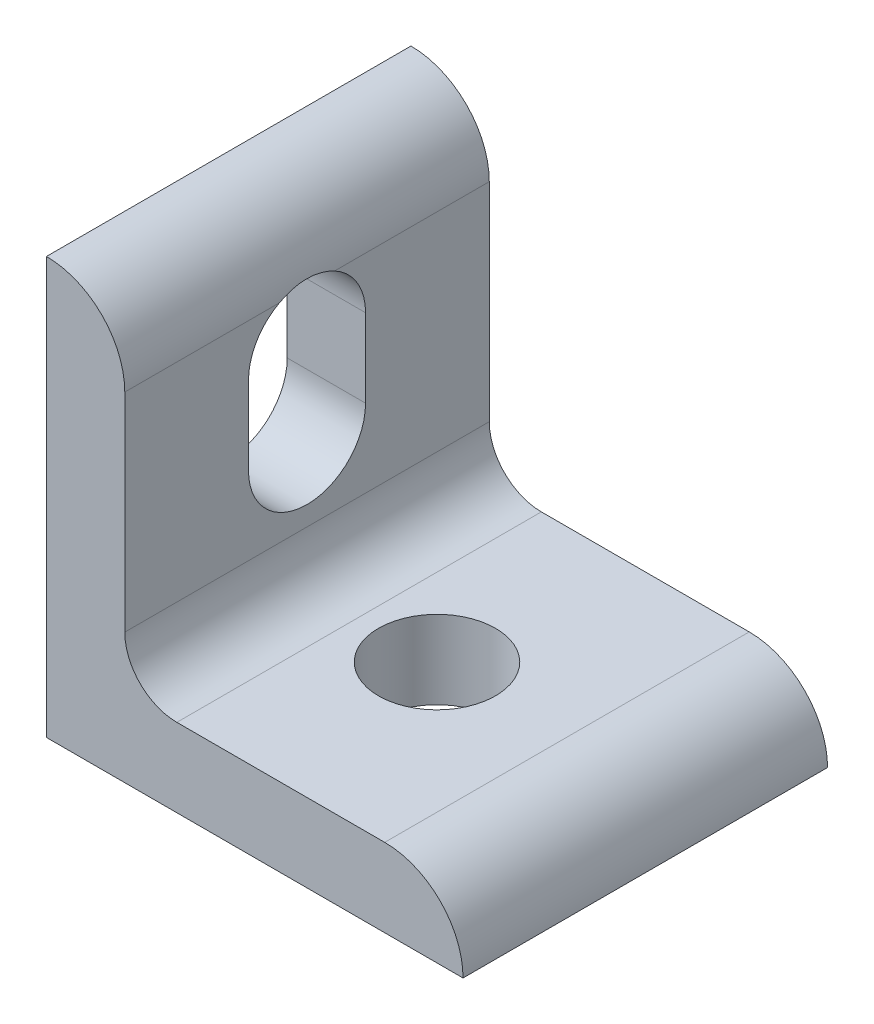
ISO-10303-21;
HEADER;
FILE_DESCRIPTION(('STEP AP214'),'2;1');
FILE_NAME('part.step','',(''),(''),'','','');
FILE_SCHEMA(('AUTOMOTIVE_DESIGN { 1 0 10303 214 1 1 1 1 }'));
ENDSEC;
DATA;
#1=APPLICATION_CONTEXT('core data for automotive mechanical design processes');
#2=APPLICATION_PROTOCOL_DEFINITION('international standard','automotive_design',2000,#1);
#3=PRODUCT_CONTEXT('',#1,'mechanical');
#4=PRODUCT('Part','Part','',(#3));
#5=PRODUCT_RELATED_PRODUCT_CATEGORY('part','',(#4));
#6=PRODUCT_DEFINITION_FORMATION('','',#4);
#7=PRODUCT_DEFINITION_CONTEXT('part definition',#1,'design');
#8=PRODUCT_DEFINITION('design','',#6,#7);
#9=PRODUCT_DEFINITION_SHAPE('','',#8);
#10=(LENGTH_UNIT() NAMED_UNIT(*) SI_UNIT(.MILLI.,.METRE.));
#11=(NAMED_UNIT(*) PLANE_ANGLE_UNIT() SI_UNIT($,.RADIAN.));
#12=(NAMED_UNIT(*) SI_UNIT($,.STERADIAN.) SOLID_ANGLE_UNIT());
#13=UNCERTAINTY_MEASURE_WITH_UNIT(LENGTH_MEASURE(1.E-05),#10,'distance_accuracy_value','');
#14=(GEOMETRIC_REPRESENTATION_CONTEXT(3) GLOBAL_UNCERTAINTY_ASSIGNED_CONTEXT((#13)) GLOBAL_UNIT_ASSIGNED_CONTEXT((#10,
#11,#12)) REPRESENTATION_CONTEXT('',''));
#15=CARTESIAN_POINT('',(0.,0.,0.));
#16=DIRECTION('',(0.,0.,1.));
#17=DIRECTION('',(1.,0.,0.));
#18=AXIS2_PLACEMENT_3D('',#15,#16,#17);
#19=CARTESIAN_POINT('',(-12.7,7.9248,-11.1125));
#20=DIRECTION('',(0.,0.,1.));
#21=DIRECTION('',(1.,0.,0.));
#22=AXIS2_PLACEMENT_3D('',#19,#20,#21);
#23=CYLINDRICAL_SURFACE('',#22,4.7752);
#24=CARTESIAN_POINT('',(-7.9248,7.9248,-1.67798674905376));
#25=CARTESIAN_POINT('',(-7.92481560049592,7.97198264026627,-1.58944695004193));
#26=CARTESIAN_POINT('',(-7.92550012205361,8.01540977478818,-1.49891433040589));
#27=CARTESIAN_POINT('',(-7.92764776843833,8.0944880787926,-1.31452958616631));
#28=CARTESIAN_POINT('',(-7.929110840339,8.13013977662215,-1.22067768761434));
#29=CARTESIAN_POINT('',(-7.93225439032208,8.19336625267331,-1.03043614312271));
#30=CARTESIAN_POINT('',(-7.93393457377953,8.22095181424074,-0.934050074774575));
#31=CARTESIAN_POINT('',(-7.93708478391002,8.26791971032118,-0.739297367598972));
#32=CARTESIAN_POINT('',(-7.93855481380049,8.28730217043143,-0.6409307591196));
#33=CARTESIAN_POINT('',(-7.94096961658513,8.31773484760735,-0.442847496805783));
#34=CARTESIAN_POINT('',(-7.94191406229188,8.32877987596424,-0.343130041511914));
#35=CARTESIAN_POINT('',(-7.94309359017064,8.3424409536407,-0.143068965573384));
#36=CARTESIAN_POINT('',(-7.94332834804512,8.34505314954708,-0.0427250796564538));
#37=CARTESIAN_POINT('',(-7.94304377497829,8.341819075309,0.157803071244914));
#38=CARTESIAN_POINT('',(-7.94252460460013,8.33597460617069,0.257987365668804));
#39=CARTESIAN_POINT('',(-7.94083039182643,8.31587724756712,0.457456784566718));
#40=CARTESIAN_POINT('',(-7.93965566575332,8.30162841323472,0.556742319252861));
#41=CARTESIAN_POINT('',(-7.93701861799582,8.26658902460885,0.744337426092724));
#42=CARTESIAN_POINT('',(-7.93559448865452,8.24655339572945,0.832789488293525));
#43=CARTESIAN_POINT('',(-7.9326683654564,8.19981049650334,1.00790623806296));
#44=CARTESIAN_POINT('',(-7.93116637764446,8.17310374348454,1.09457106366315));
#45=CARTESIAN_POINT('',(-7.92842086118506,8.11314773705982,1.26567968386014));
#46=CARTESIAN_POINT('',(-7.92717751363214,8.07989393104252,1.35012188632909));
#47=CARTESIAN_POINT('',(-7.9253721376969,8.00704969992215,1.51624796495461));
#48=CARTESIAN_POINT('',(-7.92481020248326,7.96745840914012,1.59793146243284));
#49=CARTESIAN_POINT('',(-7.9248,7.9248,1.67798674905376));
#50=B_SPLINE_CURVE_WITH_KNOTS('',3,(#24,#25,#26,#27,#28,#29,#30,#31,#32,#33,#34,#35,#36,#37,#38,
#39,#40,#41,#42,#43,#44,#45,#46,#47,#48,#49),.UNSPECIFIED.,.F.,.F.,(4,2,2,2,2,2,2,2,2,2,2,2,4),
(0.,0.300879588223929,0.60173872506888,0.902193795053617,1.20264426462115,1.50328156242041,
1.80405621808538,2.1047668275479,2.40533246174311,2.67718634841712,2.94901916008736,
3.22104166750748,3.4931013640392),.UNSPECIFIED.);
#51=CARTESIAN_POINT('',(-7.9248,7.9248,-1.67798674905376));
#52=VERTEX_POINT('',#51);
#53=CARTESIAN_POINT('',(-7.9248,7.9248,1.67798674905376));
#54=VERTEX_POINT('',#53);
#55=EDGE_CURVE('E210',#52,#54,#50,.T.);
#56=ORIENTED_EDGE('',*,*,#55,.F.);
#57=DIRECTION('',(0.,0.,1.));
#58=VECTOR('',#57,1.);
#59=CARTESIAN_POINT('',(-7.9248,7.9248,-11.1125));
#60=LINE('',#59,#58);
#61=CARTESIAN_POINT('',(-7.9248,7.9248,-11.1125));
#62=VERTEX_POINT('',#61);
#63=EDGE_CURVE('E11',#62,#52,#60,.T.);
#64=ORIENTED_EDGE('',*,*,#63,.F.);
#65=CARTESIAN_POINT('',(-12.7,7.9248,-11.1125));
#66=DIRECTION('',(0.,0.,1.));
#67=DIRECTION('',(1.,0.,0.));
#68=AXIS2_PLACEMENT_3D('',#65,#66,#67);
#69=CIRCLE('',#68,4.7752);
#70=CARTESIAN_POINT('',(-12.7,12.7,-11.1125));
#71=VERTEX_POINT('',#70);
#72=EDGE_CURVE('E335',#62,#71,#69,.T.);
#73=ORIENTED_EDGE('',*,*,#72,.T.);
#74=DIRECTION('',(0.,0.,1.));
#75=VECTOR('',#74,1.);
#76=CARTESIAN_POINT('',(-12.7,12.7,-11.1125));
#77=LINE('',#76,#75);
#78=CARTESIAN_POINT('',(-12.7,12.7,11.1125));
#79=VERTEX_POINT('',#78);
#80=EDGE_CURVE('E51',#71,#79,#77,.T.);
#81=ORIENTED_EDGE('',*,*,#80,.T.);
#82=CARTESIAN_POINT('',(-12.7,7.9248,11.1125));
#83=DIRECTION('',(0.,0.,1.));
#84=DIRECTION('',(1.,0.,0.));
#85=AXIS2_PLACEMENT_3D('',#82,#83,#84);
#86=CIRCLE('',#85,4.7752);
#87=CARTESIAN_POINT('',(-7.9248,7.9248,11.1125));
#88=VERTEX_POINT('',#87);
#89=EDGE_CURVE('E219',#88,#79,#86,.T.);
#90=ORIENTED_EDGE('',*,*,#89,.F.);
#91=EDGE_CURVE('E57',#54,#88,#60,.T.);
#92=ORIENTED_EDGE('',*,*,#91,.F.);
#93=EDGE_LOOP('',(#56,#64,#73,#81,#90,#92));
#94=FACE_BOUND('',#93,.T.);
#95=ADVANCED_FACE('F47',(#94),#23,.T.);
#96=CARTESIAN_POINT('',(-7.9248,-4.7498,-11.1125));
#97=DIRECTION('',(1.,0.,0.));
#98=DIRECTION('',(0.,0.,-1.));
#99=AXIS2_PLACEMENT_3D('',#96,#97,#98);
#100=PLANE('',#99);
#101=CARTESIAN_POINT('',(-7.9248,4.7752,0.));
#102=DIRECTION('',(1.,0.,0.));
#103=DIRECTION('',(0.,0.,-1.));
#104=AXIS2_PLACEMENT_3D('',#101,#102,#103);
#105=CIRCLE('',#104,3.5687);
#106=CARTESIAN_POINT('',(-7.9248,4.7752,-3.5687));
#107=VERTEX_POINT('',#106);
#108=EDGE_CURVE('E211',#107,#52,#105,.T.);
#109=ORIENTED_EDGE('',*,*,#108,.F.);
#110=DIRECTION('',(0.,1.,0.));
#111=VECTOR('',#110,1.);
#112=CARTESIAN_POINT('',(-7.9248,-4.7498,-3.5687));
#113=LINE('',#112,#111);
#114=CARTESIAN_POINT('',(-7.9248,0.,-3.5687));
#115=VERTEX_POINT('',#114);
#116=EDGE_CURVE('E205',#115,#107,#113,.T.);
#117=ORIENTED_EDGE('',*,*,#116,.F.);
#118=CARTESIAN_POINT('',(-7.9248,0.,0.));
#119=DIRECTION('',(1.,0.,0.));
#120=DIRECTION('',(0.,0.,-1.));
#121=AXIS2_PLACEMENT_3D('',#118,#119,#120);
#122=CIRCLE('',#121,3.5687);
#123=CARTESIAN_POINT('',(-7.9248,0.,3.5687));
#124=VERTEX_POINT('',#123);
#125=EDGE_CURVE('E202',#124,#115,#122,.T.);
#126=ORIENTED_EDGE('',*,*,#125,.F.);
#127=DIRECTION('',(0.,-1.,0.));
#128=VECTOR('',#127,1.);
#129=CARTESIAN_POINT('',(-7.9248,-4.7498,3.5687));
#130=LINE('',#129,#128);
#131=CARTESIAN_POINT('',(-7.9248,4.7752,3.5687));
#132=VERTEX_POINT('',#131);
#133=EDGE_CURVE('E193',#132,#124,#130,.T.);
#134=ORIENTED_EDGE('',*,*,#133,.F.);
#135=EDGE_CURVE('E160',#54,#132,#105,.T.);
#136=ORIENTED_EDGE('',*,*,#135,.F.);
#137=ORIENTED_EDGE('',*,*,#91,.T.);
#138=DIRECTION('',(0.,1.,0.));
#139=VECTOR('',#138,1.);
#140=CARTESIAN_POINT('',(-7.9248,-4.7498,11.1125));
#141=LINE('',#140,#139);
#142=CARTESIAN_POINT('',(-7.9248,-4.7498,11.1125));
#143=VERTEX_POINT('',#142);
#144=EDGE_CURVE('E332',#143,#88,#141,.T.);
#145=ORIENTED_EDGE('',*,*,#144,.F.);
#146=DIRECTION('',(0.,0.,1.));
#147=VECTOR('',#146,1.);
#148=CARTESIAN_POINT('',(-7.9248,-4.7498,-11.1125));
#149=LINE('',#148,#147);
#150=CARTESIAN_POINT('',(-7.9248,-4.7498,-11.1125));
#151=VERTEX_POINT('',#150);
#152=EDGE_CURVE('E272',#151,#143,#149,.T.);
#153=ORIENTED_EDGE('',*,*,#152,.F.);
#154=DIRECTION('',(0.,1.,0.));
#155=VECTOR('',#154,1.);
#156=CARTESIAN_POINT('',(-7.9248,-4.7498,-11.1125));
#157=LINE('',#156,#155);
#158=EDGE_CURVE('E270',#151,#62,#157,.T.);
#159=ORIENTED_EDGE('',*,*,#158,.T.);
#160=ORIENTED_EDGE('',*,*,#63,.T.);
#161=EDGE_LOOP('',(#109,#117,#126,#134,#136,#137,#145,#153,#159,#160));
#162=FACE_BOUND('',#161,.T.);
#163=ADVANCED_FACE('F235',(#162),#100,.T.);
#164=CARTESIAN_POINT('',(-4.7498,-4.7498,-11.1125));
#165=DIRECTION('',(0.,0.,1.));
#166=DIRECTION('',(1.,0.,0.));
#167=AXIS2_PLACEMENT_3D('',#164,#165,#166);
#168=CYLINDRICAL_SURFACE('',#167,3.175);
#169=ORIENTED_EDGE('',*,*,#152,.T.);
#170=CARTESIAN_POINT('',(-4.7498,-4.7498,11.1125));
#171=DIRECTION('',(0.,0.,-1.));
#172=DIRECTION('',(-1.,0.,0.));
#173=AXIS2_PLACEMENT_3D('',#170,#171,#172);
#174=CIRCLE('',#173,3.175);
#175=CARTESIAN_POINT('',(-4.7498,-7.9248,11.1125));
#176=VERTEX_POINT('',#175);
#177=EDGE_CURVE('E328',#176,#143,#174,.T.);
#178=ORIENTED_EDGE('',*,*,#177,.F.);
#179=DIRECTION('',(0.,0.,1.));
#180=VECTOR('',#179,1.);
#181=CARTESIAN_POINT('',(-4.7498,-7.9248,-11.1125));
#182=LINE('',#181,#180);
#183=CARTESIAN_POINT('',(-4.7498,-7.9248,-11.1125));
#184=VERTEX_POINT('',#183);
#185=EDGE_CURVE('E288',#184,#176,#182,.T.);
#186=ORIENTED_EDGE('',*,*,#185,.F.);
#187=CARTESIAN_POINT('',(-4.7498,-4.7498,-11.1125));
#188=DIRECTION('',(0.,0.,-1.));
#189=DIRECTION('',(-1.,0.,0.));
#190=AXIS2_PLACEMENT_3D('',#187,#188,#189);
#191=CIRCLE('',#190,3.175);
#192=EDGE_CURVE('E276',#184,#151,#191,.T.);
#193=ORIENTED_EDGE('',*,*,#192,.T.);
#194=EDGE_LOOP('',(#169,#178,#186,#193));
#195=FACE_BOUND('',#194,.T.);
#196=ADVANCED_FACE('F238',(#195),#168,.F.);
#197=CARTESIAN_POINT('',(7.9248,-7.9248,-11.1125));
#198=DIRECTION('',(0.,1.,0.));
#199=DIRECTION('',(-1.,0.,0.));
#200=AXIS2_PLACEMENT_3D('',#197,#198,#199);
#201=PLANE('',#200);
#202=CARTESIAN_POINT('',(0.,-7.9248,0.));
#203=DIRECTION('',(0.,1.,0.));
#204=DIRECTION('',(-1.,0.,0.));
#205=AXIS2_PLACEMENT_3D('',#202,#203,#204);
#206=CIRCLE('',#205,3.5687);
#207=CARTESIAN_POINT('',(-3.5687,-7.9248,0.));
#208=VERTEX_POINT('',#207);
#209=EDGE_CURVE('E182',#208,#208,#206,.T.);
#210=ORIENTED_EDGE('',*,*,#209,.F.);
#211=EDGE_LOOP('',(#210));
#212=FACE_BOUND('',#211,.T.);
#213=ORIENTED_EDGE('',*,*,#185,.T.);
#214=DIRECTION('',(-1.,0.,0.));
#215=VECTOR('',#214,1.);
#216=CARTESIAN_POINT('',(7.9248,-7.9248,11.1125));
#217=LINE('',#216,#215);
#218=CARTESIAN_POINT('',(7.9248,-7.9248,11.1125));
#219=VERTEX_POINT('',#218);
#220=EDGE_CURVE('E322',#219,#176,#217,.T.);
#221=ORIENTED_EDGE('',*,*,#220,.F.);
#222=DIRECTION('',(0.,0.,1.));
#223=VECTOR('',#222,1.);
#224=CARTESIAN_POINT('',(7.9248,-7.9248,-11.1125));
#225=LINE('',#224,#223);
#226=CARTESIAN_POINT('',(7.9248,-7.9248,-11.1125));
#227=VERTEX_POINT('',#226);
#228=EDGE_CURVE('E291',#227,#219,#225,.T.);
#229=ORIENTED_EDGE('',*,*,#228,.F.);
#230=DIRECTION('',(-1.,0.,0.));
#231=VECTOR('',#230,1.);
#232=CARTESIAN_POINT('',(7.9248,-7.9248,-11.1125));
#233=LINE('',#232,#231);
#234=EDGE_CURVE('E283',#227,#184,#233,.T.);
#235=ORIENTED_EDGE('',*,*,#234,.T.);
#236=EDGE_LOOP('',(#213,#221,#229,#235));
#237=FACE_BOUND('',#236,.T.);
#238=ADVANCED_FACE('F242',(#212,#237),#201,.T.);
#239=CARTESIAN_POINT('',(7.9248,-12.7,-11.1125));
#240=DIRECTION('',(0.,0.,1.));
#241=DIRECTION('',(1.,0.,0.));
#242=AXIS2_PLACEMENT_3D('',#239,#240,#241);
#243=CYLINDRICAL_SURFACE('',#242,4.7752);
#244=ORIENTED_EDGE('',*,*,#228,.T.);
#245=CARTESIAN_POINT('',(7.9248,-12.7,11.1125));
#246=DIRECTION('',(0.,0.,1.));
#247=DIRECTION('',(-1.,0.,0.));
#248=AXIS2_PLACEMENT_3D('',#245,#246,#247);
#249=CIRCLE('',#248,4.7752);
#250=CARTESIAN_POINT('',(12.7,-12.7,11.1125));
#251=VERTEX_POINT('',#250);
#252=EDGE_CURVE('E317',#251,#219,#249,.T.);
#253=ORIENTED_EDGE('',*,*,#252,.F.);
#254=DIRECTION('',(0.,0.,1.));
#255=VECTOR('',#254,1.);
#256=CARTESIAN_POINT('',(12.7,-12.7,-11.1125));
#257=LINE('',#256,#255);
#258=CARTESIAN_POINT('',(12.7,-12.7,-11.1125));
#259=VERTEX_POINT('',#258);
#260=EDGE_CURVE('E294',#259,#251,#257,.T.);
#261=ORIENTED_EDGE('',*,*,#260,.F.);
#262=CARTESIAN_POINT('',(7.9248,-12.7,-11.1125));
#263=DIRECTION('',(0.,0.,1.));
#264=DIRECTION('',(-1.,0.,0.));
#265=AXIS2_PLACEMENT_3D('',#262,#263,#264);
#266=CIRCLE('',#265,4.7752);
#267=EDGE_CURVE('E342',#259,#227,#266,.T.);
#268=ORIENTED_EDGE('',*,*,#267,.T.);
#269=EDGE_LOOP('',(#244,#253,#261,#268));
#270=FACE_BOUND('',#269,.T.);
#271=ADVANCED_FACE('F246',(#270),#243,.T.);
#272=CARTESIAN_POINT('',(-12.7,-12.7,-11.1125));
#273=DIRECTION('',(0.,-1.,0.));
#274=DIRECTION('',(0.,0.,-1.));
#275=AXIS2_PLACEMENT_3D('',#272,#273,#274);
#276=PLANE('',#275);
#277=CARTESIAN_POINT('',(0.,-12.7,0.));
#278=DIRECTION('',(0.,1.,0.));
#279=DIRECTION('',(-1.,0.,0.));
#280=AXIS2_PLACEMENT_3D('',#277,#278,#279);
#281=CIRCLE('',#280,3.5687);
#282=CARTESIAN_POINT('',(-3.5687,-12.7,0.));
#283=VERTEX_POINT('',#282);
#284=EDGE_CURVE('E176',#283,#283,#281,.T.);
#285=ORIENTED_EDGE('',*,*,#284,.T.);
#286=EDGE_LOOP('',(#285));
#287=FACE_BOUND('',#286,.T.);
#288=ORIENTED_EDGE('',*,*,#260,.T.);
#289=DIRECTION('',(1.,0.,0.));
#290=VECTOR('',#289,1.);
#291=CARTESIAN_POINT('',(-12.7,-12.7,11.1125));
#292=LINE('',#291,#290);
#293=CARTESIAN_POINT('',(-12.7,-12.7,11.1125));
#294=VERTEX_POINT('',#293);
#295=EDGE_CURVE('E312',#294,#251,#292,.T.);
#296=ORIENTED_EDGE('',*,*,#295,.F.);
#297=DIRECTION('',(0.,0.,1.));
#298=VECTOR('',#297,1.);
#299=CARTESIAN_POINT('',(-12.7,-12.7,-11.1125));
#300=LINE('',#299,#298);
#301=CARTESIAN_POINT('',(-12.7,-12.7,-11.1125));
#302=VERTEX_POINT('',#301);
#303=EDGE_CURVE('E282',#302,#294,#300,.T.);
#304=ORIENTED_EDGE('',*,*,#303,.F.);
#305=DIRECTION('',(1.,0.,0.));
#306=VECTOR('',#305,1.);
#307=CARTESIAN_POINT('',(-12.7,-12.7,-11.1125));
#308=LINE('',#307,#306);
#309=EDGE_CURVE('E339',#302,#259,#308,.T.);
#310=ORIENTED_EDGE('',*,*,#309,.T.);
#311=EDGE_LOOP('',(#288,#296,#304,#310));
#312=FACE_BOUND('',#311,.T.);
#313=ADVANCED_FACE('F250',(#287,#312),#276,.T.);
#314=CARTESIAN_POINT('',(-12.7,12.7,-11.1125));
#315=DIRECTION('',(-1.,0.,0.));
#316=DIRECTION('',(0.,0.,1.));
#317=AXIS2_PLACEMENT_3D('',#314,#315,#316);
#318=PLANE('',#317);
#319=CARTESIAN_POINT('',(-12.7,4.7752,0.));
#320=DIRECTION('',(1.,0.,0.));
#321=DIRECTION('',(0.,0.,-1.));
#322=AXIS2_PLACEMENT_3D('',#319,#320,#321);
#323=CIRCLE('',#322,3.5687);
#324=CARTESIAN_POINT('',(-12.7,4.7752,-3.5687));
#325=VERTEX_POINT('',#324);
#326=CARTESIAN_POINT('',(-12.7,4.7752,3.5687));
#327=VERTEX_POINT('',#326);
#328=EDGE_CURVE('E157',#325,#327,#323,.T.);
#329=ORIENTED_EDGE('',*,*,#328,.T.);
#330=DIRECTION('',(0.,-1.,0.));
#331=VECTOR('',#330,1.);
#332=CARTESIAN_POINT('',(-12.7,4.7752,3.5687));
#333=LINE('',#332,#331);
#334=CARTESIAN_POINT('',(-12.7,0.,3.5687));
#335=VERTEX_POINT('',#334);
#336=EDGE_CURVE('E167',#327,#335,#333,.T.);
#337=ORIENTED_EDGE('',*,*,#336,.T.);
#338=CARTESIAN_POINT('',(-12.7,0.,0.));
#339=DIRECTION('',(1.,0.,0.));
#340=DIRECTION('',(0.,0.,-1.));
#341=AXIS2_PLACEMENT_3D('',#338,#339,#340);
#342=CIRCLE('',#341,3.5687);
#343=CARTESIAN_POINT('',(-12.7,0.,-3.5687));
#344=VERTEX_POINT('',#343);
#345=EDGE_CURVE('E78',#335,#344,#342,.T.);
#346=ORIENTED_EDGE('',*,*,#345,.T.);
#347=DIRECTION('',(0.,1.,0.));
#348=VECTOR('',#347,1.);
#349=CARTESIAN_POINT('',(-12.7,4.7752,-3.5687));
#350=LINE('',#349,#348);
#351=EDGE_CURVE('E164',#344,#325,#350,.T.);
#352=ORIENTED_EDGE('',*,*,#351,.T.);
#353=EDGE_LOOP('',(#329,#337,#346,#352));
#354=FACE_BOUND('',#353,.T.);
#355=ORIENTED_EDGE('',*,*,#303,.T.);
#356=DIRECTION('',(0.,-1.,0.));
#357=VECTOR('',#356,1.);
#358=CARTESIAN_POINT('',(-12.7,12.7,11.1125));
#359=LINE('',#358,#357);
#360=EDGE_CURVE('E302',#79,#294,#359,.T.);
#361=ORIENTED_EDGE('',*,*,#360,.F.);
#362=ORIENTED_EDGE('',*,*,#80,.F.);
#363=DIRECTION('',(0.,-1.,0.));
#364=VECTOR('',#363,1.);
#365=CARTESIAN_POINT('',(-12.7,12.7,-11.1125));
#366=LINE('',#365,#364);
#367=EDGE_CURVE('E305',#71,#302,#366,.T.);
#368=ORIENTED_EDGE('',*,*,#367,.T.);
#369=EDGE_LOOP('',(#355,#361,#362,#368));
#370=FACE_BOUND('',#369,.T.);
#371=ADVANCED_FACE('F172',(#354,#370),#318,.T.);
#372=CARTESIAN_POINT('',(-12.7,7.9248,-11.1125));
#373=DIRECTION('',(0.,0.,1.));
#374=DIRECTION('',(1.,0.,0.));
#375=AXIS2_PLACEMENT_3D('',#372,#373,#374);
#376=PLANE('',#375);
#377=ORIENTED_EDGE('',*,*,#72,.F.);
#378=ORIENTED_EDGE('',*,*,#158,.F.);
#379=ORIENTED_EDGE('',*,*,#192,.F.);
#380=ORIENTED_EDGE('',*,*,#234,.F.);
#381=ORIENTED_EDGE('',*,*,#267,.F.);
#382=ORIENTED_EDGE('',*,*,#309,.F.);
#383=ORIENTED_EDGE('',*,*,#367,.F.);
#384=EDGE_LOOP('',(#377,#378,#379,#380,#381,#382,#383));
#385=FACE_BOUND('',#384,.T.);
#386=ADVANCED_FACE('F230',(#385),#376,.F.);
#387=CARTESIAN_POINT('',(-12.7,7.9248,11.1125));
#388=DIRECTION('',(0.,0.,1.));
#389=DIRECTION('',(1.,0.,0.));
#390=AXIS2_PLACEMENT_3D('',#387,#388,#389);
#391=PLANE('',#390);
#392=ORIENTED_EDGE('',*,*,#89,.T.);
#393=ORIENTED_EDGE('',*,*,#360,.T.);
#394=ORIENTED_EDGE('',*,*,#295,.T.);
#395=ORIENTED_EDGE('',*,*,#252,.T.);
#396=ORIENTED_EDGE('',*,*,#220,.T.);
#397=ORIENTED_EDGE('',*,*,#177,.T.);
#398=ORIENTED_EDGE('',*,*,#144,.T.);
#399=EDGE_LOOP('',(#392,#393,#394,#395,#396,#397,#398));
#400=FACE_BOUND('',#399,.T.);
#401=ADVANCED_FACE('F226',(#400),#391,.T.);
#402=CARTESIAN_POINT('',(-12.7,4.7752,0.));
#403=DIRECTION('',(1.,0.,0.));
#404=DIRECTION('',(0.,0.,-1.));
#405=AXIS2_PLACEMENT_3D('',#402,#403,#404);
#406=CYLINDRICAL_SURFACE('',#405,3.5687);
#407=ORIENTED_EDGE('',*,*,#108,.T.);
#408=ORIENTED_EDGE('',*,*,#55,.T.);
#409=ORIENTED_EDGE('',*,*,#135,.T.);
#410=DIRECTION('',(1.,0.,0.));
#411=VECTOR('',#410,1.);
#412=CARTESIAN_POINT('',(-12.7,4.7752,3.5687));
#413=LINE('',#412,#411);
#414=EDGE_CURVE('E68',#327,#132,#413,.T.);
#415=ORIENTED_EDGE('',*,*,#414,.F.);
#416=ORIENTED_EDGE('',*,*,#328,.F.);
#417=DIRECTION('',(1.,0.,0.));
#418=VECTOR('',#417,1.);
#419=CARTESIAN_POINT('',(-12.7,4.7752,-3.5687));
#420=LINE('',#419,#418);
#421=EDGE_CURVE('E190',#325,#107,#420,.T.);
#422=ORIENTED_EDGE('',*,*,#421,.T.);
#423=EDGE_LOOP('',(#407,#408,#409,#415,#416,#422));
#424=FACE_BOUND('',#423,.T.);
#425=ADVANCED_FACE('F154',(#424),#406,.F.);
#426=CARTESIAN_POINT('',(-12.7,4.7752,-3.5687));
#427=DIRECTION('',(0.,0.,-1.));
#428=DIRECTION('',(0.,1.,0.));
#429=AXIS2_PLACEMENT_3D('',#426,#427,#428);
#430=PLANE('',#429);
#431=ORIENTED_EDGE('',*,*,#116,.T.);
#432=ORIENTED_EDGE('',*,*,#421,.F.);
#433=ORIENTED_EDGE('',*,*,#351,.F.);
#434=DIRECTION('',(1.,0.,0.));
#435=VECTOR('',#434,1.);
#436=CARTESIAN_POINT('',(-12.7,0.,-3.5687));
#437=LINE('',#436,#435);
#438=EDGE_CURVE('E194',#344,#115,#437,.T.);
#439=ORIENTED_EDGE('',*,*,#438,.T.);
#440=EDGE_LOOP('',(#431,#432,#433,#439));
#441=FACE_BOUND('',#440,.T.);
#442=ADVANCED_FACE('F225',(#441),#430,.F.);
#443=CARTESIAN_POINT('',(-12.7,0.,0.));
#444=DIRECTION('',(1.,0.,0.));
#445=DIRECTION('',(0.,0.,-1.));
#446=AXIS2_PLACEMENT_3D('',#443,#444,#445);
#447=CYLINDRICAL_SURFACE('',#446,3.5687);
#448=ORIENTED_EDGE('',*,*,#125,.T.);
#449=ORIENTED_EDGE('',*,*,#438,.F.);
#450=ORIENTED_EDGE('',*,*,#345,.F.);
#451=DIRECTION('',(1.,0.,0.));
#452=VECTOR('',#451,1.);
#453=CARTESIAN_POINT('',(-12.7,0.,3.5687));
#454=LINE('',#453,#452);
#455=EDGE_CURVE('E163',#335,#124,#454,.T.);
#456=ORIENTED_EDGE('',*,*,#455,.T.);
#457=EDGE_LOOP('',(#448,#449,#450,#456));
#458=FACE_BOUND('',#457,.T.);
#459=ADVANCED_FACE('F397',(#458),#447,.F.);
#460=CARTESIAN_POINT('',(-12.7,4.7752,3.5687));
#461=DIRECTION('',(0.,0.,1.));
#462=DIRECTION('',(0.,-1.,0.));
#463=AXIS2_PLACEMENT_3D('',#460,#461,#462);
#464=PLANE('',#463);
#465=ORIENTED_EDGE('',*,*,#133,.T.);
#466=ORIENTED_EDGE('',*,*,#455,.F.);
#467=ORIENTED_EDGE('',*,*,#336,.F.);
#468=ORIENTED_EDGE('',*,*,#414,.T.);
#469=EDGE_LOOP('',(#465,#466,#467,#468));
#470=FACE_BOUND('',#469,.T.);
#471=ADVANCED_FACE('F168',(#470),#464,.F.);
#472=CARTESIAN_POINT('',(0.,-12.7,0.));
#473=DIRECTION('',(0.,1.,0.));
#474=DIRECTION('',(-1.,0.,0.));
#475=AXIS2_PLACEMENT_3D('',#472,#473,#474);
#476=CYLINDRICAL_SURFACE('',#475,3.5687);
#477=ORIENTED_EDGE('',*,*,#284,.F.);
#478=EDGE_LOOP('',(#477));
#479=FACE_BOUND('',#478,.T.);
#480=ORIENTED_EDGE('',*,*,#209,.T.);
#481=EDGE_LOOP('',(#480));
#482=FACE_BOUND('',#481,.T.);
#483=ADVANCED_FACE('F391',(#479,#482),#476,.F.);
#484=CLOSED_SHELL('',(#95,#163,#196,#238,#271,#313,#371,#386,#401,#425,#442,#459,#471,#483));
#485=MANIFOLD_SOLID_BREP('B2',#484);
#486=ADVANCED_BREP_SHAPE_REPRESENTATION('',(#18,#485),#14);
#487=SHAPE_DEFINITION_REPRESENTATION(#9,#486);
ENDSEC;
END-ISO-10303-21;
